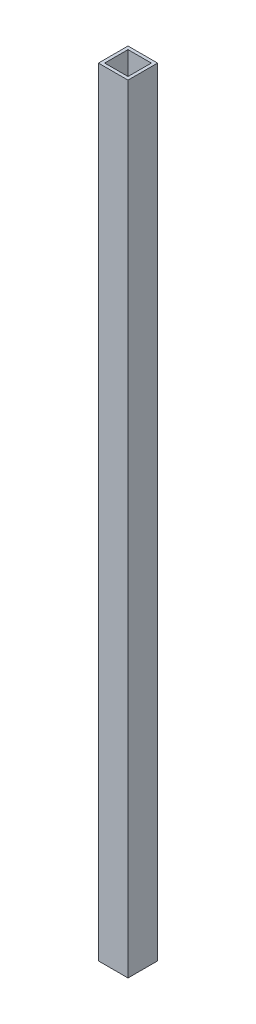
ISO-10303-21;
HEADER;
FILE_DESCRIPTION(('STEP AP214'),'2;1');
FILE_NAME('part.step','',(''),(''),'','','');
FILE_SCHEMA(('AUTOMOTIVE_DESIGN { 1 0 10303 214 1 1 1 1 }'));
ENDSEC;
DATA;
#1=APPLICATION_CONTEXT('core data for automotive mechanical design processes');
#2=APPLICATION_PROTOCOL_DEFINITION('international standard','automotive_design',2000,#1);
#3=PRODUCT_CONTEXT('',#1,'mechanical');
#4=PRODUCT('Part','Part','',(#3));
#5=PRODUCT_RELATED_PRODUCT_CATEGORY('part','',(#4));
#6=PRODUCT_DEFINITION_FORMATION('','',#4);
#7=PRODUCT_DEFINITION_CONTEXT('part definition',#1,'design');
#8=PRODUCT_DEFINITION('design','',#6,#7);
#9=PRODUCT_DEFINITION_SHAPE('','',#8);
#10=(LENGTH_UNIT() NAMED_UNIT(*) SI_UNIT(.MILLI.,.METRE.));
#11=(NAMED_UNIT(*) PLANE_ANGLE_UNIT() SI_UNIT($,.RADIAN.));
#12=(NAMED_UNIT(*) SI_UNIT($,.STERADIAN.) SOLID_ANGLE_UNIT());
#13=UNCERTAINTY_MEASURE_WITH_UNIT(LENGTH_MEASURE(1.E-05),#10,'distance_accuracy_value','');
#14=(GEOMETRIC_REPRESENTATION_CONTEXT(3) GLOBAL_UNCERTAINTY_ASSIGNED_CONTEXT((#13)) GLOBAL_UNIT_ASSIGNED_CONTEXT((#10,
#11,#12)) REPRESENTATION_CONTEXT('',''));
#15=CARTESIAN_POINT('',(0.,0.,0.));
#16=DIRECTION('',(0.,0.,1.));
#17=DIRECTION('',(1.,0.,0.));
#18=AXIS2_PLACEMENT_3D('',#15,#16,#17);
#19=CARTESIAN_POINT('',(0.,500.,0.));
#20=DIRECTION('',(0.,1.,0.));
#21=DIRECTION('',(0.,0.,1.));
#22=AXIS2_PLACEMENT_3D('',#19,#20,#21);
#23=PLANE('',#22);
#24=DIRECTION('',(0.,0.,-1.));
#25=VECTOR('',#24,1.);
#26=CARTESIAN_POINT('',(9.5,500.,9.5));
#27=LINE('',#26,#25);
#28=CARTESIAN_POINT('',(9.5,500.,9.5));
#29=VERTEX_POINT('',#28);
#30=CARTESIAN_POINT('',(9.5,500.,-9.5));
#31=VERTEX_POINT('',#30);
#32=EDGE_CURVE('E162',#29,#31,#27,.T.);
#33=ORIENTED_EDGE('',*,*,#32,.T.);
#34=DIRECTION('',(-1.,0.,0.));
#35=VECTOR('',#34,1.);
#36=CARTESIAN_POINT('',(-9.5,500.,-9.5));
#37=LINE('',#36,#35);
#38=CARTESIAN_POINT('',(-9.5,500.,-9.5));
#39=VERTEX_POINT('',#38);
#40=EDGE_CURVE('E165',#31,#39,#37,.T.);
#41=ORIENTED_EDGE('',*,*,#40,.T.);
#42=DIRECTION('',(0.,0.,1.));
#43=VECTOR('',#42,1.);
#44=CARTESIAN_POINT('',(-9.5,500.,9.5));
#45=LINE('',#44,#43);
#46=CARTESIAN_POINT('',(-9.5,500.,9.5));
#47=VERTEX_POINT('',#46);
#48=EDGE_CURVE('E168',#39,#47,#45,.T.);
#49=ORIENTED_EDGE('',*,*,#48,.T.);
#50=DIRECTION('',(1.,0.,0.));
#51=VECTOR('',#50,1.);
#52=CARTESIAN_POINT('',(-9.5,500.,9.5));
#53=LINE('',#52,#51);
#54=EDGE_CURVE('E170',#47,#29,#53,.T.);
#55=ORIENTED_EDGE('',*,*,#54,.T.);
#56=EDGE_LOOP('',(#33,#41,#49,#55));
#57=FACE_BOUND('',#56,.T.);
#58=DIRECTION('',(-1.,0.,0.));
#59=VECTOR('',#58,1.);
#60=CARTESIAN_POINT('',(0.,500.,-7.5));
#61=LINE('',#60,#59);
#62=CARTESIAN_POINT('',(7.5,500.,-7.5));
#63=VERTEX_POINT('',#62);
#64=CARTESIAN_POINT('',(-7.5,500.,-7.5));
#65=VERTEX_POINT('',#64);
#66=EDGE_CURVE('E134',#63,#65,#61,.T.);
#67=ORIENTED_EDGE('',*,*,#66,.F.);
#68=DIRECTION('',(0.,0.,-1.));
#69=VECTOR('',#68,1.);
#70=CARTESIAN_POINT('',(7.5,500.,0.));
#71=LINE('',#70,#69);
#72=CARTESIAN_POINT('',(7.5,500.,7.5));
#73=VERTEX_POINT('',#72);
#74=EDGE_CURVE('E126',#73,#63,#71,.T.);
#75=ORIENTED_EDGE('',*,*,#74,.F.);
#76=DIRECTION('',(1.,0.,0.));
#77=VECTOR('',#76,1.);
#78=CARTESIAN_POINT('',(0.,500.,7.5));
#79=LINE('',#78,#77);
#80=CARTESIAN_POINT('',(-7.5,500.,7.5));
#81=VERTEX_POINT('',#80);
#82=EDGE_CURVE('E148',#81,#73,#79,.T.);
#83=ORIENTED_EDGE('',*,*,#82,.F.);
#84=DIRECTION('',(0.,0.,1.));
#85=VECTOR('',#84,1.);
#86=CARTESIAN_POINT('',(-7.5,500.,0.));
#87=LINE('',#86,#85);
#88=EDGE_CURVE('E146',#65,#81,#87,.T.);
#89=ORIENTED_EDGE('',*,*,#88,.F.);
#90=EDGE_LOOP('',(#67,#75,#83,#89));
#91=FACE_BOUND('',#90,.T.);
#92=ADVANCED_FACE('F61',(#57,#91),#23,.T.);
#93=CARTESIAN_POINT('',(0.,0.,0.));
#94=DIRECTION('',(0.,1.,0.));
#95=DIRECTION('',(0.,0.,1.));
#96=AXIS2_PLACEMENT_3D('',#93,#94,#95);
#97=PLANE('',#96);
#98=DIRECTION('',(0.,0.,-1.));
#99=VECTOR('',#98,1.);
#100=CARTESIAN_POINT('',(9.5,0.,9.5));
#101=LINE('',#100,#99);
#102=CARTESIAN_POINT('',(9.5,0.,9.5));
#103=VERTEX_POINT('',#102);
#104=CARTESIAN_POINT('',(9.5,0.,-9.5));
#105=VERTEX_POINT('',#104);
#106=EDGE_CURVE('E142',#103,#105,#101,.T.);
#107=ORIENTED_EDGE('',*,*,#106,.F.);
#108=DIRECTION('',(1.,0.,0.));
#109=VECTOR('',#108,1.);
#110=CARTESIAN_POINT('',(-9.5,0.,9.5));
#111=LINE('',#110,#109);
#112=CARTESIAN_POINT('',(-9.5,0.,9.5));
#113=VERTEX_POINT('',#112);
#114=EDGE_CURVE('E166',#113,#103,#111,.T.);
#115=ORIENTED_EDGE('',*,*,#114,.F.);
#116=DIRECTION('',(0.,0.,1.));
#117=VECTOR('',#116,1.);
#118=CARTESIAN_POINT('',(-9.5,0.,9.5));
#119=LINE('',#118,#117);
#120=CARTESIAN_POINT('',(-9.5,0.,-9.5));
#121=VERTEX_POINT('',#120);
#122=EDGE_CURVE('E177',#121,#113,#119,.T.);
#123=ORIENTED_EDGE('',*,*,#122,.F.);
#124=DIRECTION('',(-1.,0.,0.));
#125=VECTOR('',#124,1.);
#126=CARTESIAN_POINT('',(-9.5,0.,-9.5));
#127=LINE('',#126,#125);
#128=EDGE_CURVE('E175',#105,#121,#127,.T.);
#129=ORIENTED_EDGE('',*,*,#128,.F.);
#130=EDGE_LOOP('',(#107,#115,#123,#129));
#131=FACE_BOUND('',#130,.T.);
#132=DIRECTION('',(0.,0.,-1.));
#133=VECTOR('',#132,1.);
#134=CARTESIAN_POINT('',(7.5,0.,0.));
#135=LINE('',#134,#133);
#136=CARTESIAN_POINT('',(7.5,0.,7.5));
#137=VERTEX_POINT('',#136);
#138=CARTESIAN_POINT('',(7.5,0.,-7.5));
#139=VERTEX_POINT('',#138);
#140=EDGE_CURVE('E84',#137,#139,#135,.T.);
#141=ORIENTED_EDGE('',*,*,#140,.T.);
#142=DIRECTION('',(-1.,0.,0.));
#143=VECTOR('',#142,1.);
#144=CARTESIAN_POINT('',(0.,0.,-7.5));
#145=LINE('',#144,#143);
#146=CARTESIAN_POINT('',(-7.5,0.,-7.5));
#147=VERTEX_POINT('',#146);
#148=EDGE_CURVE('E141',#139,#147,#145,.T.);
#149=ORIENTED_EDGE('',*,*,#148,.T.);
#150=DIRECTION('',(0.,0.,1.));
#151=VECTOR('',#150,1.);
#152=CARTESIAN_POINT('',(-7.5,0.,0.));
#153=LINE('',#152,#151);
#154=CARTESIAN_POINT('',(-7.5,0.,7.5));
#155=VERTEX_POINT('',#154);
#156=EDGE_CURVE('E154',#147,#155,#153,.T.);
#157=ORIENTED_EDGE('',*,*,#156,.T.);
#158=DIRECTION('',(1.,0.,0.));
#159=VECTOR('',#158,1.);
#160=CARTESIAN_POINT('',(0.,0.,7.5));
#161=LINE('',#160,#159);
#162=EDGE_CURVE('E135',#155,#137,#161,.T.);
#163=ORIENTED_EDGE('',*,*,#162,.T.);
#164=EDGE_LOOP('',(#141,#149,#157,#163));
#165=FACE_BOUND('',#164,.T.);
#166=ADVANCED_FACE('F195',(#131,#165),#97,.F.);
#167=CARTESIAN_POINT('',(9.5,500.,9.5));
#168=DIRECTION('',(-1.,0.,0.));
#169=DIRECTION('',(0.,0.,1.));
#170=AXIS2_PLACEMENT_3D('',#167,#168,#169);
#171=PLANE('',#170);
#172=ORIENTED_EDGE('',*,*,#106,.T.);
#173=DIRECTION('',(0.,-1.,0.));
#174=VECTOR('',#173,1.);
#175=CARTESIAN_POINT('',(9.5,500.,-9.5));
#176=LINE('',#175,#174);
#177=EDGE_CURVE('E12',#31,#105,#176,.T.);
#178=ORIENTED_EDGE('',*,*,#177,.F.);
#179=ORIENTED_EDGE('',*,*,#32,.F.);
#180=DIRECTION('',(0.,-1.,0.));
#181=VECTOR('',#180,1.);
#182=CARTESIAN_POINT('',(9.5,500.,9.5));
#183=LINE('',#182,#181);
#184=EDGE_CURVE('E172',#29,#103,#183,.T.);
#185=ORIENTED_EDGE('',*,*,#184,.T.);
#186=EDGE_LOOP('',(#172,#178,#179,#185));
#187=FACE_BOUND('',#186,.T.);
#188=ADVANCED_FACE('F63',(#187),#171,.F.);
#189=CARTESIAN_POINT('',(-9.5,500.,-9.5));
#190=DIRECTION('',(0.,0.,1.));
#191=DIRECTION('',(1.,0.,0.));
#192=AXIS2_PLACEMENT_3D('',#189,#190,#191);
#193=PLANE('',#192);
#194=ORIENTED_EDGE('',*,*,#128,.T.);
#195=DIRECTION('',(0.,-1.,0.));
#196=VECTOR('',#195,1.);
#197=CARTESIAN_POINT('',(-9.5,500.,-9.5));
#198=LINE('',#197,#196);
#199=EDGE_CURVE('E69',#39,#121,#198,.T.);
#200=ORIENTED_EDGE('',*,*,#199,.F.);
#201=ORIENTED_EDGE('',*,*,#40,.F.);
#202=ORIENTED_EDGE('',*,*,#177,.T.);
#203=EDGE_LOOP('',(#194,#200,#201,#202));
#204=FACE_BOUND('',#203,.T.);
#205=ADVANCED_FACE('F205',(#204),#193,.F.);
#206=CARTESIAN_POINT('',(-9.5,500.,9.5));
#207=DIRECTION('',(1.,0.,0.));
#208=DIRECTION('',(0.,0.,-1.));
#209=AXIS2_PLACEMENT_3D('',#206,#207,#208);
#210=PLANE('',#209);
#211=ORIENTED_EDGE('',*,*,#122,.T.);
#212=DIRECTION('',(0.,-1.,0.));
#213=VECTOR('',#212,1.);
#214=CARTESIAN_POINT('',(-9.5,500.,9.5));
#215=LINE('',#214,#213);
#216=EDGE_CURVE('E182',#47,#113,#215,.T.);
#217=ORIENTED_EDGE('',*,*,#216,.F.);
#218=ORIENTED_EDGE('',*,*,#48,.F.);
#219=ORIENTED_EDGE('',*,*,#199,.T.);
#220=EDGE_LOOP('',(#211,#217,#218,#219));
#221=FACE_BOUND('',#220,.T.);
#222=ADVANCED_FACE('F189',(#221),#210,.F.);
#223=CARTESIAN_POINT('',(-9.5,500.,9.5));
#224=DIRECTION('',(0.,0.,-1.));
#225=DIRECTION('',(-1.,0.,0.));
#226=AXIS2_PLACEMENT_3D('',#223,#224,#225);
#227=PLANE('',#226);
#228=ORIENTED_EDGE('',*,*,#114,.T.);
#229=ORIENTED_EDGE('',*,*,#184,.F.);
#230=ORIENTED_EDGE('',*,*,#54,.F.);
#231=ORIENTED_EDGE('',*,*,#216,.T.);
#232=EDGE_LOOP('',(#228,#229,#230,#231));
#233=FACE_BOUND('',#232,.T.);
#234=ADVANCED_FACE('F199',(#233),#227,.F.);
#235=CARTESIAN_POINT('',(7.5,500.,0.));
#236=DIRECTION('',(-1.,0.,0.));
#237=DIRECTION('',(0.,0.,1.));
#238=AXIS2_PLACEMENT_3D('',#235,#236,#237);
#239=PLANE('',#238);
#240=ORIENTED_EDGE('',*,*,#140,.F.);
#241=DIRECTION('',(0.,-1.,0.));
#242=VECTOR('',#241,1.);
#243=CARTESIAN_POINT('',(7.5,500.,7.5));
#244=LINE('',#243,#242);
#245=EDGE_CURVE('E130',#73,#137,#244,.T.);
#246=ORIENTED_EDGE('',*,*,#245,.F.);
#247=ORIENTED_EDGE('',*,*,#74,.T.);
#248=DIRECTION('',(0.,-1.,0.));
#249=VECTOR('',#248,1.);
#250=CARTESIAN_POINT('',(7.5,500.,-7.5));
#251=LINE('',#250,#249);
#252=EDGE_CURVE('E129',#63,#139,#251,.T.);
#253=ORIENTED_EDGE('',*,*,#252,.T.);
#254=EDGE_LOOP('',(#240,#246,#247,#253));
#255=FACE_BOUND('',#254,.T.);
#256=ADVANCED_FACE('F128',(#255),#239,.T.);
#257=CARTESIAN_POINT('',(0.,500.,-7.5));
#258=DIRECTION('',(0.,0.,1.));
#259=DIRECTION('',(1.,0.,0.));
#260=AXIS2_PLACEMENT_3D('',#257,#258,#259);
#261=PLANE('',#260);
#262=ORIENTED_EDGE('',*,*,#148,.F.);
#263=ORIENTED_EDGE('',*,*,#252,.F.);
#264=ORIENTED_EDGE('',*,*,#66,.T.);
#265=DIRECTION('',(0.,-1.,0.));
#266=VECTOR('',#265,1.);
#267=CARTESIAN_POINT('',(-7.5,500.,-7.5));
#268=LINE('',#267,#266);
#269=EDGE_CURVE('E143',#65,#147,#268,.T.);
#270=ORIENTED_EDGE('',*,*,#269,.T.);
#271=EDGE_LOOP('',(#262,#263,#264,#270));
#272=FACE_BOUND('',#271,.T.);
#273=ADVANCED_FACE('F138',(#272),#261,.T.);
#274=CARTESIAN_POINT('',(-7.5,500.,0.));
#275=DIRECTION('',(1.,0.,0.));
#276=DIRECTION('',(0.,0.,-1.));
#277=AXIS2_PLACEMENT_3D('',#274,#275,#276);
#278=PLANE('',#277);
#279=ORIENTED_EDGE('',*,*,#156,.F.);
#280=ORIENTED_EDGE('',*,*,#269,.F.);
#281=ORIENTED_EDGE('',*,*,#88,.T.);
#282=DIRECTION('',(0.,-1.,0.));
#283=VECTOR('',#282,1.);
#284=CARTESIAN_POINT('',(-7.5,500.,7.5));
#285=LINE('',#284,#283);
#286=EDGE_CURVE('E76',#81,#155,#285,.T.);
#287=ORIENTED_EDGE('',*,*,#286,.T.);
#288=EDGE_LOOP('',(#279,#280,#281,#287));
#289=FACE_BOUND('',#288,.T.);
#290=ADVANCED_FACE('F228',(#289),#278,.T.);
#291=CARTESIAN_POINT('',(0.,500.,7.5));
#292=DIRECTION('',(0.,0.,-1.));
#293=DIRECTION('',(-1.,0.,0.));
#294=AXIS2_PLACEMENT_3D('',#291,#292,#293);
#295=PLANE('',#294);
#296=ORIENTED_EDGE('',*,*,#162,.F.);
#297=ORIENTED_EDGE('',*,*,#286,.F.);
#298=ORIENTED_EDGE('',*,*,#82,.T.);
#299=ORIENTED_EDGE('',*,*,#245,.T.);
#300=EDGE_LOOP('',(#296,#297,#298,#299));
#301=FACE_BOUND('',#300,.T.);
#302=ADVANCED_FACE('F232',(#301),#295,.T.);
#303=CLOSED_SHELL('',(#92,#166,#188,#205,#222,#234,#256,#273,#290,#302));
#304=MANIFOLD_SOLID_BREP('B2',#303);
#305=ADVANCED_BREP_SHAPE_REPRESENTATION('',(#18,#304),#14);
#306=SHAPE_DEFINITION_REPRESENTATION(#9,#305);
ENDSEC;
END-ISO-10303-21;
